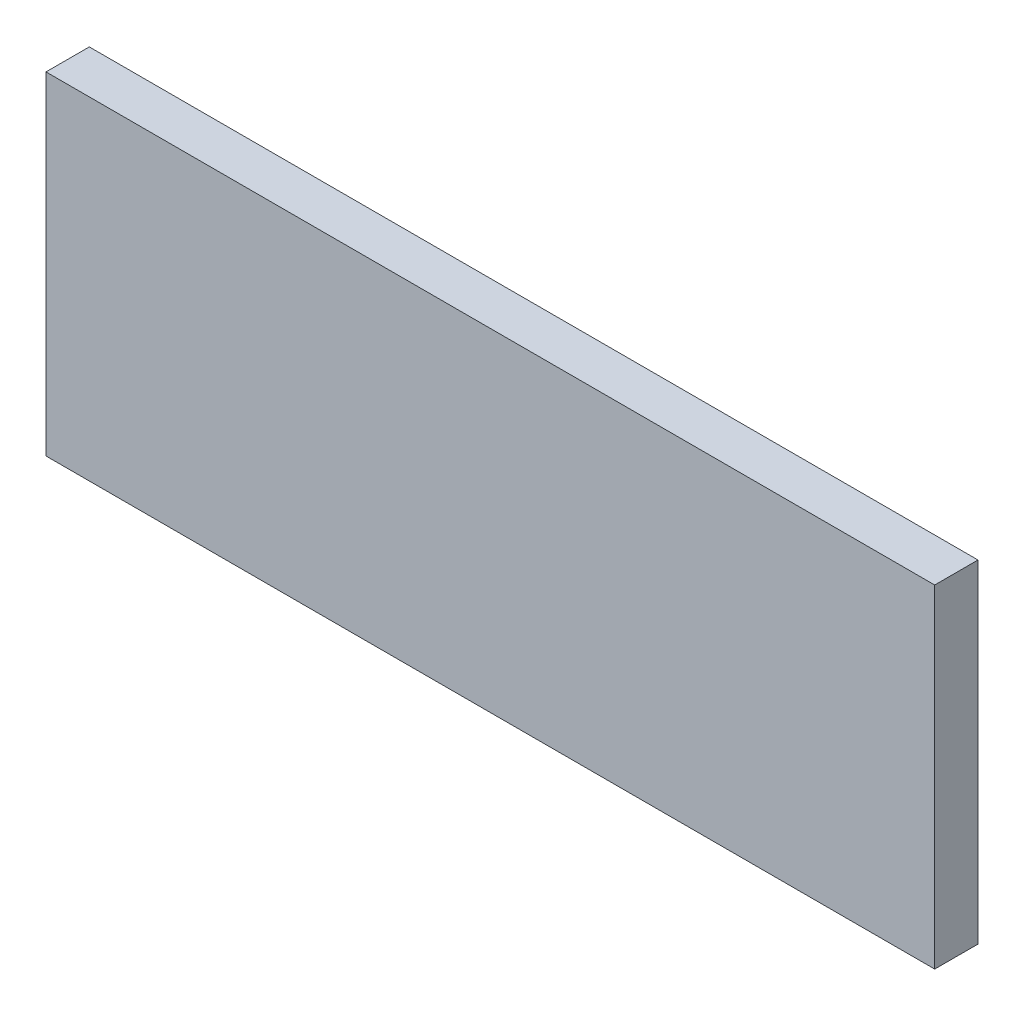
ISO-10303-21;
HEADER;
FILE_DESCRIPTION(('STEP AP214'),'2;1');
FILE_NAME('part.step','',(''),(''),'','','');
FILE_SCHEMA(('AUTOMOTIVE_DESIGN { 1 0 10303 214 1 1 1 1 }'));
ENDSEC;
DATA;
#1=APPLICATION_CONTEXT('core data for automotive mechanical design processes');
#2=APPLICATION_PROTOCOL_DEFINITION('international standard','automotive_design',2000,#1);
#3=PRODUCT_CONTEXT('',#1,'mechanical');
#4=PRODUCT('Part','Part','',(#3));
#5=PRODUCT_RELATED_PRODUCT_CATEGORY('part','',(#4));
#6=PRODUCT_DEFINITION_FORMATION('','',#4);
#7=PRODUCT_DEFINITION_CONTEXT('part definition',#1,'design');
#8=PRODUCT_DEFINITION('design','',#6,#7);
#9=PRODUCT_DEFINITION_SHAPE('','',#8);
#10=(LENGTH_UNIT() NAMED_UNIT(*) SI_UNIT(.MILLI.,.METRE.));
#11=(NAMED_UNIT(*) PLANE_ANGLE_UNIT() SI_UNIT($,.RADIAN.));
#12=(NAMED_UNIT(*) SI_UNIT($,.STERADIAN.) SOLID_ANGLE_UNIT());
#13=UNCERTAINTY_MEASURE_WITH_UNIT(LENGTH_MEASURE(1.E-05),#10,'distance_accuracy_value','');
#14=(GEOMETRIC_REPRESENTATION_CONTEXT(3) GLOBAL_UNCERTAINTY_ASSIGNED_CONTEXT((#13)) GLOBAL_UNIT_ASSIGNED_CONTEXT((#10,
#11,#12)) REPRESENTATION_CONTEXT('',''));
#15=CARTESIAN_POINT('',(0.,0.,0.));
#16=DIRECTION('',(0.,0.,1.));
#17=DIRECTION('',(1.,0.,0.));
#18=AXIS2_PLACEMENT_3D('',#15,#16,#17);
#19=CARTESIAN_POINT('',(2.141468161074,1.797968062298,1.1));
#20=DIRECTION('',(0.,0.,1.));
#21=DIRECTION('',(1.,0.,0.));
#22=AXIS2_PLACEMENT_3D('',#19,#20,#21);
#23=PLANE('',#22);
#24=DIRECTION('',(1.,0.,0.));
#25=VECTOR('',#24,1.);
#26=CARTESIAN_POINT('',(2.038849102768,1.874793560355,1.1));
#27=LINE('',#26,#25);
#28=CARTESIAN_POINT('',(2.24408721938,1.874793560355,1.1));
#29=VERTEX_POINT('',#28);
#30=CARTESIAN_POINT('',(2.038849102768,1.874793560355,1.1));
#31=VERTEX_POINT('',#30);
#32=EDGE_CURVE('E20',#29,#31,#27,.F.);
#33=ORIENTED_EDGE('',*,*,#32,.F.);
#34=DIRECTION('',(0.,1.,0.));
#35=VECTOR('',#34,1.);
#36=CARTESIAN_POINT('',(2.24408721938,1.874793560355,1.1));
#37=LINE('',#36,#35);
#38=CARTESIAN_POINT('',(2.24408721938,1.797968062298,1.1));
#39=VERTEX_POINT('',#38);
#40=EDGE_CURVE('E80',#39,#29,#37,.T.);
#41=ORIENTED_EDGE('',*,*,#40,.F.);
#42=DIRECTION('',(1.,0.,0.));
#43=VECTOR('',#42,1.);
#44=CARTESIAN_POINT('',(2.24408721938,1.797968062298,1.1));
#45=LINE('',#44,#43);
#46=CARTESIAN_POINT('',(2.038849102768,1.797968062298,1.1));
#47=VERTEX_POINT('',#46);
#48=EDGE_CURVE('E68',#47,#39,#45,.T.);
#49=ORIENTED_EDGE('',*,*,#48,.F.);
#50=DIRECTION('',(0.,1.,0.));
#51=VECTOR('',#50,1.);
#52=CARTESIAN_POINT('',(2.038849102768,1.797968062298,1.1));
#53=LINE('',#52,#51);
#54=EDGE_CURVE('E55',#31,#47,#53,.F.);
#55=ORIENTED_EDGE('',*,*,#54,.F.);
#56=EDGE_LOOP('',(#33,#41,#49,#55));
#57=FACE_BOUND('',#56,.T.);
#58=ADVANCED_FACE('F17',(#57),#23,.F.);
#59=CARTESIAN_POINT('',(2.038849102768,1.874793560355,1.11));
#60=DIRECTION('',(0.,1.,0.));
#61=DIRECTION('',(0.,0.,1.));
#62=AXIS2_PLACEMENT_3D('',#59,#60,#61);
#63=PLANE('',#62);
#64=ORIENTED_EDGE('',*,*,#32,.T.);
#65=DIRECTION('',(0.,0.,1.));
#66=VECTOR('',#65,1.);
#67=CARTESIAN_POINT('',(2.038849102768,1.874793560355,1.11));
#68=LINE('',#67,#66);
#69=CARTESIAN_POINT('',(2.038849102768,1.874793560355,1.11));
#70=VERTEX_POINT('',#69);
#71=EDGE_CURVE('E61',#70,#31,#68,.F.);
#72=ORIENTED_EDGE('',*,*,#71,.F.);
#73=DIRECTION('',(1.,0.,0.));
#74=VECTOR('',#73,1.);
#75=CARTESIAN_POINT('',(2.141468161074,1.874793560355,1.11));
#76=LINE('',#75,#74);
#77=CARTESIAN_POINT('',(2.24408721938,1.874793560355,1.11));
#78=VERTEX_POINT('',#77);
#79=EDGE_CURVE('E83',#78,#70,#76,.F.);
#80=ORIENTED_EDGE('',*,*,#79,.F.);
#81=DIRECTION('',(0.,0.,-1.));
#82=VECTOR('',#81,1.);
#83=CARTESIAN_POINT('',(2.24408721938,1.874793560355,1.11));
#84=LINE('',#83,#82);
#85=EDGE_CURVE('E64',#29,#78,#84,.F.);
#86=ORIENTED_EDGE('',*,*,#85,.F.);
#87=EDGE_LOOP('',(#64,#72,#80,#86));
#88=FACE_BOUND('',#87,.T.);
#89=ADVANCED_FACE('F60',(#88),#63,.T.);
#90=CARTESIAN_POINT('',(2.038849102768,1.797968062298,1.11));
#91=DIRECTION('',(-1.,0.,0.));
#92=DIRECTION('',(0.,0.,1.));
#93=AXIS2_PLACEMENT_3D('',#90,#91,#92);
#94=PLANE('',#93);
#95=ORIENTED_EDGE('',*,*,#54,.T.);
#96=DIRECTION('',(0.,0.,-1.));
#97=VECTOR('',#96,1.);
#98=CARTESIAN_POINT('',(2.038849102768,1.797968062298,1.11));
#99=LINE('',#98,#97);
#100=CARTESIAN_POINT('',(2.038849102768,1.797968062298,1.11));
#101=VERTEX_POINT('',#100);
#102=EDGE_CURVE('E70',#101,#47,#99,.T.);
#103=ORIENTED_EDGE('',*,*,#102,.F.);
#104=DIRECTION('',(0.,1.,0.));
#105=VECTOR('',#104,1.);
#106=CARTESIAN_POINT('',(2.038849102768,1.797968062298,1.11));
#107=LINE('',#106,#105);
#108=EDGE_CURVE('E74',#70,#101,#107,.F.);
#109=ORIENTED_EDGE('',*,*,#108,.F.);
#110=ORIENTED_EDGE('',*,*,#71,.T.);
#111=EDGE_LOOP('',(#95,#103,#109,#110));
#112=FACE_BOUND('',#111,.T.);
#113=ADVANCED_FACE('F72',(#112),#94,.T.);
#114=CARTESIAN_POINT('',(2.24408721938,1.797968062298,1.11));
#115=DIRECTION('',(0.,-1.,0.));
#116=DIRECTION('',(0.,0.,-1.));
#117=AXIS2_PLACEMENT_3D('',#114,#115,#116);
#118=PLANE('',#117);
#119=ORIENTED_EDGE('',*,*,#48,.T.);
#120=DIRECTION('',(0.,0.,-1.));
#121=VECTOR('',#120,1.);
#122=CARTESIAN_POINT('',(2.24408721938,1.797968062298,1.11));
#123=LINE('',#122,#121);
#124=CARTESIAN_POINT('',(2.24408721938,1.797968062298,1.11));
#125=VERTEX_POINT('',#124);
#126=EDGE_CURVE('E35',#125,#39,#123,.T.);
#127=ORIENTED_EDGE('',*,*,#126,.F.);
#128=DIRECTION('',(1.,0.,0.));
#129=VECTOR('',#128,1.);
#130=CARTESIAN_POINT('',(2.141468161074,1.797968062298,1.11));
#131=LINE('',#130,#129);
#132=EDGE_CURVE('E26',#101,#125,#131,.T.);
#133=ORIENTED_EDGE('',*,*,#132,.F.);
#134=ORIENTED_EDGE('',*,*,#102,.T.);
#135=EDGE_LOOP('',(#119,#127,#133,#134));
#136=FACE_BOUND('',#135,.T.);
#137=ADVANCED_FACE('F89',(#136),#118,.T.);
#138=CARTESIAN_POINT('',(2.24408721938,1.874793560355,1.11));
#139=DIRECTION('',(1.,0.,0.));
#140=DIRECTION('',(0.,0.,-1.));
#141=AXIS2_PLACEMENT_3D('',#138,#139,#140);
#142=PLANE('',#141);
#143=ORIENTED_EDGE('',*,*,#40,.T.);
#144=ORIENTED_EDGE('',*,*,#85,.T.);
#145=DIRECTION('',(0.,1.,0.));
#146=VECTOR('',#145,1.);
#147=CARTESIAN_POINT('',(2.24408721938,1.797968062298,1.11));
#148=LINE('',#147,#146);
#149=EDGE_CURVE('E11',#125,#78,#148,.T.);
#150=ORIENTED_EDGE('',*,*,#149,.F.);
#151=ORIENTED_EDGE('',*,*,#126,.T.);
#152=EDGE_LOOP('',(#143,#144,#150,#151));
#153=FACE_BOUND('',#152,.T.);
#154=ADVANCED_FACE('F91',(#153),#142,.T.);
#155=CARTESIAN_POINT('',(2.141468161074,1.797968062298,1.11));
#156=DIRECTION('',(0.,0.,1.));
#157=DIRECTION('',(1.,0.,0.));
#158=AXIS2_PLACEMENT_3D('',#155,#156,#157);
#159=PLANE('',#158);
#160=ORIENTED_EDGE('',*,*,#132,.T.);
#161=ORIENTED_EDGE('',*,*,#149,.T.);
#162=ORIENTED_EDGE('',*,*,#79,.T.);
#163=ORIENTED_EDGE('',*,*,#108,.T.);
#164=EDGE_LOOP('',(#160,#161,#162,#163));
#165=FACE_BOUND('',#164,.T.);
#166=ADVANCED_FACE('F88',(#165),#159,.T.);
#167=CLOSED_SHELL('',(#58,#89,#113,#137,#154,#166));
#168=MANIFOLD_SOLID_BREP('B1',#167);
#169=ADVANCED_BREP_SHAPE_REPRESENTATION('',(#18,#168),#14);
#170=SHAPE_DEFINITION_REPRESENTATION(#9,#169);
ENDSEC;
END-ISO-10303-21;
